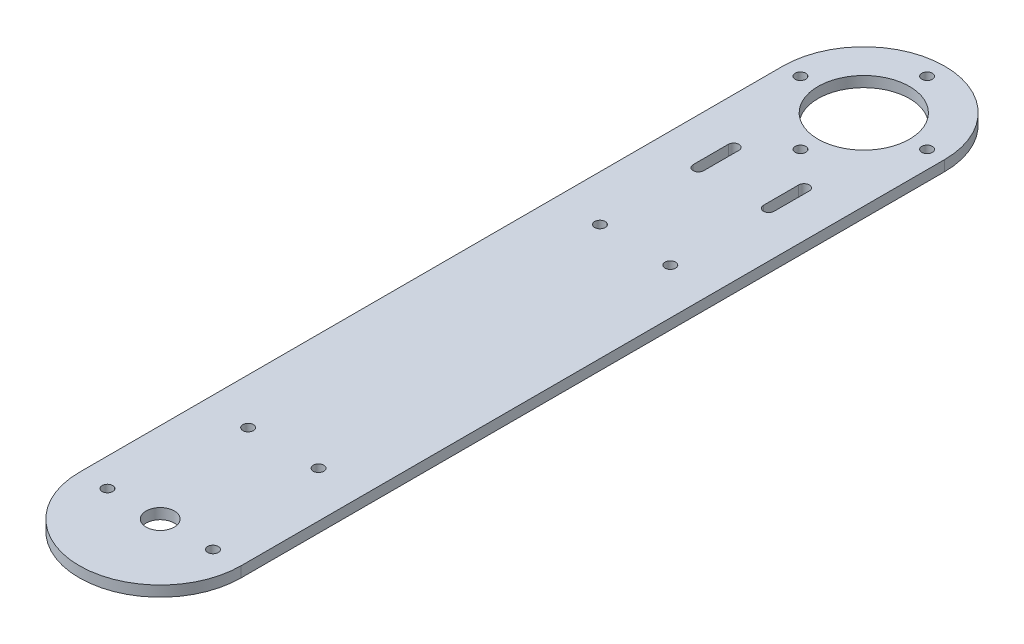
ISO-10303-21;
HEADER;
FILE_DESCRIPTION(('STEP AP214'),'2;1');
FILE_NAME('part.step','',(''),(''),'','','');
FILE_SCHEMA(('AUTOMOTIVE_DESIGN { 1 0 10303 214 1 1 1 1 }'));
ENDSEC;
DATA;
#1=APPLICATION_CONTEXT('core data for automotive mechanical design processes');
#2=APPLICATION_PROTOCOL_DEFINITION('international standard','automotive_design',2000,#1);
#3=PRODUCT_CONTEXT('',#1,'mechanical');
#4=PRODUCT('Part','Part','',(#3));
#5=PRODUCT_RELATED_PRODUCT_CATEGORY('part','',(#4));
#6=PRODUCT_DEFINITION_FORMATION('','',#4);
#7=PRODUCT_DEFINITION_CONTEXT('part definition',#1,'design');
#8=PRODUCT_DEFINITION('design','',#6,#7);
#9=PRODUCT_DEFINITION_SHAPE('','',#8);
#10=(LENGTH_UNIT() NAMED_UNIT(*) SI_UNIT(.MILLI.,.METRE.));
#11=(NAMED_UNIT(*) PLANE_ANGLE_UNIT() SI_UNIT($,.RADIAN.));
#12=(NAMED_UNIT(*) SI_UNIT($,.STERADIAN.) SOLID_ANGLE_UNIT());
#13=UNCERTAINTY_MEASURE_WITH_UNIT(LENGTH_MEASURE(1.E-05),#10,'distance_accuracy_value','');
#14=(GEOMETRIC_REPRESENTATION_CONTEXT(3) GLOBAL_UNCERTAINTY_ASSIGNED_CONTEXT((#13)) GLOBAL_UNIT_ASSIGNED_CONTEXT((#10,
#11,#12)) REPRESENTATION_CONTEXT('',''));
#15=CARTESIAN_POINT('',(0.,0.,0.));
#16=DIRECTION('',(0.,0.,1.));
#17=DIRECTION('',(1.,0.,0.));
#18=AXIS2_PLACEMENT_3D('',#15,#16,#17);
#19=CARTESIAN_POINT('',(0.,-3.,-200.));
#20=DIRECTION('',(0.,1.,0.));
#21=DIRECTION('',(0.,0.,1.));
#22=AXIS2_PLACEMENT_3D('',#19,#20,#21);
#23=CYLINDRICAL_SURFACE('',#22,23.);
#24=CARTESIAN_POINT('',(0.,0.,-200.));
#25=DIRECTION('',(0.,1.,0.));
#26=DIRECTION('',(0.,0.,1.));
#27=AXIS2_PLACEMENT_3D('',#24,#25,#26);
#28=CIRCLE('',#27,23.);
#29=CARTESIAN_POINT('',(23.,0.,-200.));
#30=VERTEX_POINT('',#29);
#31=CARTESIAN_POINT('',(-23.,0.,-200.));
#32=VERTEX_POINT('',#31);
#33=EDGE_CURVE('E251',#30,#32,#28,.T.);
#34=ORIENTED_EDGE('',*,*,#33,.F.);
#35=DIRECTION('',(0.,1.,0.));
#36=VECTOR('',#35,1.);
#37=CARTESIAN_POINT('',(23.,-3.,-200.));
#38=LINE('',#37,#36);
#39=CARTESIAN_POINT('',(23.,-3.,-200.));
#40=VERTEX_POINT('',#39);
#41=EDGE_CURVE('E11',#40,#30,#38,.T.);
#42=ORIENTED_EDGE('',*,*,#41,.F.);
#43=CARTESIAN_POINT('',(0.,-3.,-200.));
#44=DIRECTION('',(0.,1.,0.));
#45=DIRECTION('',(0.,0.,1.));
#46=AXIS2_PLACEMENT_3D('',#43,#44,#45);
#47=CIRCLE('',#46,23.);
#48=CARTESIAN_POINT('',(-23.,-3.,-200.));
#49=VERTEX_POINT('',#48);
#50=EDGE_CURVE('E254',#40,#49,#47,.T.);
#51=ORIENTED_EDGE('',*,*,#50,.T.);
#52=DIRECTION('',(0.,1.,0.));
#53=VECTOR('',#52,1.);
#54=CARTESIAN_POINT('',(-23.,-3.,-200.));
#55=LINE('',#54,#53);
#56=EDGE_CURVE('E41',#49,#32,#55,.T.);
#57=ORIENTED_EDGE('',*,*,#56,.T.);
#58=EDGE_LOOP('',(#34,#42,#51,#57));
#59=FACE_BOUND('',#58,.T.);
#60=ADVANCED_FACE('F38',(#59),#23,.T.);
#61=CARTESIAN_POINT('',(23.,-3.,-200.));
#62=DIRECTION('',(1.,0.,0.));
#63=DIRECTION('',(0.,0.,-1.));
#64=AXIS2_PLACEMENT_3D('',#61,#62,#63);
#65=PLANE('',#64);
#66=DIRECTION('',(0.,0.,-1.));
#67=VECTOR('',#66,1.);
#68=CARTESIAN_POINT('',(23.,0.,-200.));
#69=LINE('',#68,#67);
#70=CARTESIAN_POINT('',(23.,0.,0.));
#71=VERTEX_POINT('',#70);
#72=EDGE_CURVE('E258',#71,#30,#69,.T.);
#73=ORIENTED_EDGE('',*,*,#72,.F.);
#74=DIRECTION('',(0.,1.,0.));
#75=VECTOR('',#74,1.);
#76=CARTESIAN_POINT('',(23.,-3.,0.));
#77=LINE('',#76,#75);
#78=CARTESIAN_POINT('',(23.,-3.,0.));
#79=VERTEX_POINT('',#78);
#80=EDGE_CURVE('E46',#79,#71,#77,.T.);
#81=ORIENTED_EDGE('',*,*,#80,.F.);
#82=DIRECTION('',(0.,0.,-1.));
#83=VECTOR('',#82,1.);
#84=CARTESIAN_POINT('',(23.,-3.,-200.));
#85=LINE('',#84,#83);
#86=EDGE_CURVE('E264',#79,#40,#85,.T.);
#87=ORIENTED_EDGE('',*,*,#86,.T.);
#88=ORIENTED_EDGE('',*,*,#41,.T.);
#89=EDGE_LOOP('',(#73,#81,#87,#88));
#90=FACE_BOUND('',#89,.T.);
#91=ADVANCED_FACE('F290',(#90),#65,.T.);
#92=CARTESIAN_POINT('',(0.,-3.,0.));
#93=DIRECTION('',(0.,1.,0.));
#94=DIRECTION('',(0.,0.,1.));
#95=AXIS2_PLACEMENT_3D('',#92,#93,#94);
#96=CYLINDRICAL_SURFACE('',#95,23.);
#97=CARTESIAN_POINT('',(0.,0.,0.));
#98=DIRECTION('',(0.,1.,0.));
#99=DIRECTION('',(0.,0.,1.));
#100=AXIS2_PLACEMENT_3D('',#97,#98,#99);
#101=CIRCLE('',#100,23.);
#102=CARTESIAN_POINT('',(-23.,0.,0.));
#103=VERTEX_POINT('',#102);
#104=EDGE_CURVE('E272',#103,#71,#101,.T.);
#105=ORIENTED_EDGE('',*,*,#104,.F.);
#106=DIRECTION('',(0.,1.,0.));
#107=VECTOR('',#106,1.);
#108=CARTESIAN_POINT('',(-23.,-3.,0.));
#109=LINE('',#108,#107);
#110=CARTESIAN_POINT('',(-23.,-3.,0.));
#111=VERTEX_POINT('',#110);
#112=EDGE_CURVE('E277',#111,#103,#109,.T.);
#113=ORIENTED_EDGE('',*,*,#112,.F.);
#114=CARTESIAN_POINT('',(0.,-3.,0.));
#115=DIRECTION('',(0.,1.,0.));
#116=DIRECTION('',(0.,0.,1.));
#117=AXIS2_PLACEMENT_3D('',#114,#115,#116);
#118=CIRCLE('',#117,23.);
#119=EDGE_CURVE('E261',#111,#79,#118,.T.);
#120=ORIENTED_EDGE('',*,*,#119,.T.);
#121=ORIENTED_EDGE('',*,*,#80,.T.);
#122=EDGE_LOOP('',(#105,#113,#120,#121));
#123=FACE_BOUND('',#122,.T.);
#124=ADVANCED_FACE('F295',(#123),#96,.T.);
#125=CARTESIAN_POINT('',(-23.,-3.,0.));
#126=DIRECTION('',(-1.,0.,0.));
#127=DIRECTION('',(0.,0.,1.));
#128=AXIS2_PLACEMENT_3D('',#125,#126,#127);
#129=PLANE('',#128);
#130=DIRECTION('',(0.,0.,1.));
#131=VECTOR('',#130,1.);
#132=CARTESIAN_POINT('',(-23.,0.,0.));
#133=LINE('',#132,#131);
#134=EDGE_CURVE('E269',#32,#103,#133,.T.);
#135=ORIENTED_EDGE('',*,*,#134,.F.);
#136=ORIENTED_EDGE('',*,*,#56,.F.);
#137=DIRECTION('',(0.,0.,1.));
#138=VECTOR('',#137,1.);
#139=CARTESIAN_POINT('',(-23.,-3.,0.));
#140=LINE('',#139,#138);
#141=EDGE_CURVE('E257',#49,#111,#140,.T.);
#142=ORIENTED_EDGE('',*,*,#141,.T.);
#143=ORIENTED_EDGE('',*,*,#112,.T.);
#144=EDGE_LOOP('',(#135,#136,#142,#143));
#145=FACE_BOUND('',#144,.T.);
#146=ADVANCED_FACE('F285',(#145),#129,.T.);
#147=CARTESIAN_POINT('',(0.,-3.,-200.));
#148=DIRECTION('',(0.,1.,0.));
#149=DIRECTION('',(0.,0.,1.));
#150=AXIS2_PLACEMENT_3D('',#147,#148,#149);
#151=PLANE('',#150);
#152=CARTESIAN_POINT('',(-17.9999999999995,-3.,-200.));
#153=DIRECTION('',(0.,1.,0.));
#154=DIRECTION('',(0.,0.,1.));
#155=AXIS2_PLACEMENT_3D('',#152,#153,#154);
#156=CIRCLE('',#155,1.49999999999999);
#157=CARTESIAN_POINT('',(-17.9999999999995,-3.,-198.5));
#158=VERTEX_POINT('',#157);
#159=EDGE_CURVE('E594',#158,#158,#156,.T.);
#160=ORIENTED_EDGE('',*,*,#159,.T.);
#161=EDGE_LOOP('',(#160));
#162=FACE_BOUND('',#161,.T.);
#163=CARTESIAN_POINT('',(5.65430358768441E-13,-3.,-182.));
#164=DIRECTION('',(0.,1.,0.));
#165=DIRECTION('',(0.,0.,1.));
#166=AXIS2_PLACEMENT_3D('',#163,#164,#165);
#167=CIRCLE('',#166,1.5);
#168=CARTESIAN_POINT('',(5.65430358768441E-13,-3.,-180.5));
#169=VERTEX_POINT('',#168);
#170=EDGE_CURVE('E602',#169,#169,#167,.T.);
#171=ORIENTED_EDGE('',*,*,#170,.T.);
#172=EDGE_LOOP('',(#171));
#173=FACE_BOUND('',#172,.T.);
#174=CARTESIAN_POINT('',(18.0000000000005,-3.,-200.));
#175=DIRECTION('',(0.,1.,0.));
#176=DIRECTION('',(0.,0.,1.));
#177=AXIS2_PLACEMENT_3D('',#174,#175,#176);
#178=CIRCLE('',#177,1.5);
#179=CARTESIAN_POINT('',(18.0000000000005,-3.,-198.5));
#180=VERTEX_POINT('',#179);
#181=EDGE_CURVE('E158',#180,#180,#178,.T.);
#182=ORIENTED_EDGE('',*,*,#181,.T.);
#183=EDGE_LOOP('',(#182));
#184=FACE_BOUND('',#183,.T.);
#185=DIRECTION('',(0.,0.,-1.));
#186=VECTOR('',#185,1.);
#187=CARTESIAN_POINT('',(-8.5,-3.,-173.));
#188=LINE('',#187,#186);
#189=CARTESIAN_POINT('',(-8.5,-3.,-163.));
#190=VERTEX_POINT('',#189);
#191=CARTESIAN_POINT('',(-8.5,-3.,-173.));
#192=VERTEX_POINT('',#191);
#193=EDGE_CURVE('E135',#190,#192,#188,.T.);
#194=ORIENTED_EDGE('',*,*,#193,.T.);
#195=CARTESIAN_POINT('',(-10.,-3.,-173.));
#196=DIRECTION('',(0.,1.,0.));
#197=DIRECTION('',(0.,0.,1.));
#198=AXIS2_PLACEMENT_3D('',#195,#196,#197);
#199=CIRCLE('',#198,1.5);
#200=CARTESIAN_POINT('',(-11.5,-3.,-173.));
#201=VERTEX_POINT('',#200);
#202=EDGE_CURVE('E129',#192,#201,#199,.T.);
#203=ORIENTED_EDGE('',*,*,#202,.T.);
#204=DIRECTION('',(0.,0.,1.));
#205=VECTOR('',#204,1.);
#206=CARTESIAN_POINT('',(-11.5,-3.,-173.));
#207=LINE('',#206,#205);
#208=CARTESIAN_POINT('',(-11.5,-3.,-163.));
#209=VERTEX_POINT('',#208);
#210=EDGE_CURVE('E138',#201,#209,#207,.T.);
#211=ORIENTED_EDGE('',*,*,#210,.T.);
#212=CARTESIAN_POINT('',(-10.,-3.,-163.));
#213=DIRECTION('',(0.,1.,0.));
#214=DIRECTION('',(0.,0.,1.));
#215=AXIS2_PLACEMENT_3D('',#212,#213,#214);
#216=CIRCLE('',#215,1.5);
#217=EDGE_CURVE('E54',#209,#190,#216,.T.);
#218=ORIENTED_EDGE('',*,*,#217,.T.);
#219=EDGE_LOOP('',(#194,#203,#211,#218));
#220=FACE_BOUND('',#219,.T.);
#221=CARTESIAN_POINT('',(3.14043702371736E-13,-3.,-218.));
#222=DIRECTION('',(0.,1.,0.));
#223=DIRECTION('',(0.,0.,1.));
#224=AXIS2_PLACEMENT_3D('',#221,#222,#223);
#225=CIRCLE('',#224,1.5);
#226=CARTESIAN_POINT('',(3.14043702371736E-13,-3.,-216.5));
#227=VERTEX_POINT('',#226);
#228=EDGE_CURVE('E168',#227,#227,#225,.T.);
#229=ORIENTED_EDGE('',*,*,#228,.T.);
#230=EDGE_LOOP('',(#229));
#231=FACE_BOUND('',#230,.T.);
#232=CARTESIAN_POINT('',(-15.,-3.,0.));
#233=DIRECTION('',(0.,1.,0.));
#234=DIRECTION('',(0.,0.,1.));
#235=AXIS2_PLACEMENT_3D('',#232,#233,#234);
#236=CIRCLE('',#235,1.5);
#237=CARTESIAN_POINT('',(-15.,-3.,1.5));
#238=VERTEX_POINT('',#237);
#239=EDGE_CURVE('E174',#238,#238,#236,.T.);
#240=ORIENTED_EDGE('',*,*,#239,.T.);
#241=EDGE_LOOP('',(#240));
#242=FACE_BOUND('',#241,.T.);
#243=CARTESIAN_POINT('',(15.,-3.,0.));
#244=DIRECTION('',(0.,1.,0.));
#245=DIRECTION('',(0.,0.,1.));
#246=AXIS2_PLACEMENT_3D('',#243,#244,#245);
#247=CIRCLE('',#246,1.5);
#248=CARTESIAN_POINT('',(15.,-3.,1.5));
#249=VERTEX_POINT('',#248);
#250=EDGE_CURVE('E180',#249,#249,#247,.T.);
#251=ORIENTED_EDGE('',*,*,#250,.T.);
#252=EDGE_LOOP('',(#251));
#253=FACE_BOUND('',#252,.T.);
#254=DIRECTION('',(0.,0.,1.));
#255=VECTOR('',#254,1.);
#256=CARTESIAN_POINT('',(8.5,-3.,-163.));
#257=LINE('',#256,#255);
#258=CARTESIAN_POINT('',(8.5,-3.,-173.));
#259=VERTEX_POINT('',#258);
#260=CARTESIAN_POINT('',(8.5,-3.,-163.));
#261=VERTEX_POINT('',#260);
#262=EDGE_CURVE('E196',#259,#261,#257,.T.);
#263=ORIENTED_EDGE('',*,*,#262,.T.);
#264=CARTESIAN_POINT('',(10.,-3.,-163.));
#265=DIRECTION('',(0.,1.,0.));
#266=DIRECTION('',(0.,0.,1.));
#267=AXIS2_PLACEMENT_3D('',#264,#265,#266);
#268=CIRCLE('',#267,1.5);
#269=CARTESIAN_POINT('',(11.5,-3.,-163.));
#270=VERTEX_POINT('',#269);
#271=EDGE_CURVE('E186',#261,#270,#268,.T.);
#272=ORIENTED_EDGE('',*,*,#271,.T.);
#273=DIRECTION('',(0.,0.,-1.));
#274=VECTOR('',#273,1.);
#275=CARTESIAN_POINT('',(11.5,-3.,-163.));
#276=LINE('',#275,#274);
#277=CARTESIAN_POINT('',(11.5,-3.,-173.));
#278=VERTEX_POINT('',#277);
#279=EDGE_CURVE('E189',#270,#278,#276,.T.);
#280=ORIENTED_EDGE('',*,*,#279,.T.);
#281=CARTESIAN_POINT('',(10.,-3.,-173.));
#282=DIRECTION('',(0.,1.,0.));
#283=DIRECTION('',(0.,0.,1.));
#284=AXIS2_PLACEMENT_3D('',#281,#282,#283);
#285=CIRCLE('',#284,1.5);
#286=EDGE_CURVE('E193',#278,#259,#285,.T.);
#287=ORIENTED_EDGE('',*,*,#286,.T.);
#288=EDGE_LOOP('',(#263,#272,#280,#287));
#289=FACE_BOUND('',#288,.T.);
#290=CARTESIAN_POINT('',(0.,-3.,-200.));
#291=DIRECTION('',(0.,1.,0.));
#292=DIRECTION('',(0.,0.,1.));
#293=AXIS2_PLACEMENT_3D('',#290,#291,#292);
#294=CIRCLE('',#293,13.);
#295=CARTESIAN_POINT('',(0.,-3.,-187.));
#296=VERTEX_POINT('',#295);
#297=EDGE_CURVE('E218',#296,#296,#294,.T.);
#298=ORIENTED_EDGE('',*,*,#297,.T.);
#299=EDGE_LOOP('',(#298));
#300=FACE_BOUND('',#299,.T.);
#301=CARTESIAN_POINT('',(9.99999999999999,-3.,-135.));
#302=DIRECTION('',(0.,1.,0.));
#303=DIRECTION('',(0.,0.,1.));
#304=AXIS2_PLACEMENT_3D('',#301,#302,#303);
#305=CIRCLE('',#304,1.5);
#306=CARTESIAN_POINT('',(9.99999999999999,-3.,-133.5));
#307=VERTEX_POINT('',#306);
#308=EDGE_CURVE('E224',#307,#307,#305,.T.);
#309=ORIENTED_EDGE('',*,*,#308,.T.);
#310=EDGE_LOOP('',(#309));
#311=FACE_BOUND('',#310,.T.);
#312=CARTESIAN_POINT('',(-10.,-3.,-135.));
#313=DIRECTION('',(0.,1.,0.));
#314=DIRECTION('',(0.,0.,1.));
#315=AXIS2_PLACEMENT_3D('',#312,#313,#314);
#316=CIRCLE('',#315,1.5);
#317=CARTESIAN_POINT('',(-10.,-3.,-133.5));
#318=VERTEX_POINT('',#317);
#319=EDGE_CURVE('E230',#318,#318,#316,.T.);
#320=ORIENTED_EDGE('',*,*,#319,.T.);
#321=EDGE_LOOP('',(#320));
#322=FACE_BOUND('',#321,.T.);
#323=CARTESIAN_POINT('',(10.,-3.,-35.));
#324=DIRECTION('',(0.,1.,0.));
#325=DIRECTION('',(0.,0.,1.));
#326=AXIS2_PLACEMENT_3D('',#323,#324,#325);
#327=CIRCLE('',#326,1.5);
#328=CARTESIAN_POINT('',(10.,-3.,-33.5));
#329=VERTEX_POINT('',#328);
#330=EDGE_CURVE('E236',#329,#329,#327,.T.);
#331=ORIENTED_EDGE('',*,*,#330,.T.);
#332=EDGE_LOOP('',(#331));
#333=FACE_BOUND('',#332,.T.);
#334=CARTESIAN_POINT('',(-10.,-3.,-35.));
#335=DIRECTION('',(0.,1.,0.));
#336=DIRECTION('',(0.,0.,1.));
#337=AXIS2_PLACEMENT_3D('',#334,#335,#336);
#338=CIRCLE('',#337,1.5);
#339=CARTESIAN_POINT('',(-10.,-3.,-33.5));
#340=VERTEX_POINT('',#339);
#341=EDGE_CURVE('E242',#340,#340,#338,.T.);
#342=ORIENTED_EDGE('',*,*,#341,.T.);
#343=EDGE_LOOP('',(#342));
#344=FACE_BOUND('',#343,.T.);
#345=CARTESIAN_POINT('',(0.,-3.,0.));
#346=DIRECTION('',(0.,1.,0.));
#347=DIRECTION('',(0.,0.,1.));
#348=AXIS2_PLACEMENT_3D('',#345,#346,#347);
#349=CIRCLE('',#348,4.);
#350=CARTESIAN_POINT('',(0.,-3.,4.));
#351=VERTEX_POINT('',#350);
#352=EDGE_CURVE('E248',#351,#351,#349,.T.);
#353=ORIENTED_EDGE('',*,*,#352,.T.);
#354=EDGE_LOOP('',(#353));
#355=FACE_BOUND('',#354,.T.);
#356=ORIENTED_EDGE('',*,*,#50,.F.);
#357=ORIENTED_EDGE('',*,*,#86,.F.);
#358=ORIENTED_EDGE('',*,*,#119,.F.);
#359=ORIENTED_EDGE('',*,*,#141,.F.);
#360=EDGE_LOOP('',(#356,#357,#358,#359));
#361=FACE_BOUND('',#360,.T.);
#362=ADVANCED_FACE('F142',(#162,#173,#184,#220,#231,#242,#253,#289,#300,#311,#322,#333,#344,
#355,#361),#151,.F.);
#363=CARTESIAN_POINT('',(0.,0.,-200.));
#364=DIRECTION('',(0.,1.,0.));
#365=DIRECTION('',(0.,0.,1.));
#366=AXIS2_PLACEMENT_3D('',#363,#364,#365);
#367=PLANE('',#366);
#368=CARTESIAN_POINT('',(-17.9999999999995,0.,-200.));
#369=DIRECTION('',(0.,1.,0.));
#370=DIRECTION('',(0.,0.,1.));
#371=AXIS2_PLACEMENT_3D('',#368,#369,#370);
#372=CIRCLE('',#371,1.49999999999999);
#373=CARTESIAN_POINT('',(-17.9999999999995,0.,-198.5));
#374=VERTEX_POINT('',#373);
#375=EDGE_CURVE('E597',#374,#374,#372,.T.);
#376=ORIENTED_EDGE('',*,*,#375,.F.);
#377=EDGE_LOOP('',(#376));
#378=FACE_BOUND('',#377,.T.);
#379=CARTESIAN_POINT('',(5.65430358768441E-13,0.,-182.));
#380=DIRECTION('',(0.,1.,0.));
#381=DIRECTION('',(0.,0.,1.));
#382=AXIS2_PLACEMENT_3D('',#379,#380,#381);
#383=CIRCLE('',#382,1.5);
#384=CARTESIAN_POINT('',(5.65430358768441E-13,0.,-180.5));
#385=VERTEX_POINT('',#384);
#386=EDGE_CURVE('E599',#385,#385,#383,.T.);
#387=ORIENTED_EDGE('',*,*,#386,.F.);
#388=EDGE_LOOP('',(#387));
#389=FACE_BOUND('',#388,.T.);
#390=CARTESIAN_POINT('',(18.0000000000005,0.,-200.));
#391=DIRECTION('',(0.,1.,0.));
#392=DIRECTION('',(0.,0.,1.));
#393=AXIS2_PLACEMENT_3D('',#390,#391,#392);
#394=CIRCLE('',#393,1.5);
#395=CARTESIAN_POINT('',(18.0000000000005,0.,-198.5));
#396=VERTEX_POINT('',#395);
#397=EDGE_CURVE('E151',#396,#396,#394,.T.);
#398=ORIENTED_EDGE('',*,*,#397,.F.);
#399=EDGE_LOOP('',(#398));
#400=FACE_BOUND('',#399,.T.);
#401=CARTESIAN_POINT('',(-10.,0.,-173.));
#402=DIRECTION('',(0.,1.,0.));
#403=DIRECTION('',(0.,0.,1.));
#404=AXIS2_PLACEMENT_3D('',#401,#402,#403);
#405=CIRCLE('',#404,1.5);
#406=CARTESIAN_POINT('',(-8.5,0.,-173.));
#407=VERTEX_POINT('',#406);
#408=CARTESIAN_POINT('',(-11.5,0.,-173.));
#409=VERTEX_POINT('',#408);
#410=EDGE_CURVE('E62',#407,#409,#405,.T.);
#411=ORIENTED_EDGE('',*,*,#410,.F.);
#412=DIRECTION('',(0.,0.,-1.));
#413=VECTOR('',#412,1.);
#414=CARTESIAN_POINT('',(-8.5,0.,-173.));
#415=LINE('',#414,#413);
#416=CARTESIAN_POINT('',(-8.5,0.,-163.));
#417=VERTEX_POINT('',#416);
#418=EDGE_CURVE('E145',#417,#407,#415,.T.);
#419=ORIENTED_EDGE('',*,*,#418,.F.);
#420=CARTESIAN_POINT('',(-10.,0.,-163.));
#421=DIRECTION('',(0.,1.,0.));
#422=DIRECTION('',(0.,0.,1.));
#423=AXIS2_PLACEMENT_3D('',#420,#421,#422);
#424=CIRCLE('',#423,1.5);
#425=CARTESIAN_POINT('',(-11.5,0.,-163.));
#426=VERTEX_POINT('',#425);
#427=EDGE_CURVE('E148',#426,#417,#424,.T.);
#428=ORIENTED_EDGE('',*,*,#427,.F.);
#429=DIRECTION('',(0.,0.,1.));
#430=VECTOR('',#429,1.);
#431=CARTESIAN_POINT('',(-11.5,0.,-173.));
#432=LINE('',#431,#430);
#433=EDGE_CURVE('E157',#409,#426,#432,.T.);
#434=ORIENTED_EDGE('',*,*,#433,.F.);
#435=EDGE_LOOP('',(#411,#419,#428,#434));
#436=FACE_BOUND('',#435,.T.);
#437=CARTESIAN_POINT('',(3.14043702371736E-13,0.,-218.));
#438=DIRECTION('',(0.,1.,0.));
#439=DIRECTION('',(0.,0.,1.));
#440=AXIS2_PLACEMENT_3D('',#437,#438,#439);
#441=CIRCLE('',#440,1.5);
#442=CARTESIAN_POINT('',(3.14043702371736E-13,0.,-216.5));
#443=VERTEX_POINT('',#442);
#444=EDGE_CURVE('E164',#443,#443,#441,.T.);
#445=ORIENTED_EDGE('',*,*,#444,.F.);
#446=EDGE_LOOP('',(#445));
#447=FACE_BOUND('',#446,.T.);
#448=CARTESIAN_POINT('',(-15.,0.,0.));
#449=DIRECTION('',(0.,1.,0.));
#450=DIRECTION('',(0.,0.,1.));
#451=AXIS2_PLACEMENT_3D('',#448,#449,#450);
#452=CIRCLE('',#451,1.5);
#453=CARTESIAN_POINT('',(-15.,0.,1.5));
#454=VERTEX_POINT('',#453);
#455=EDGE_CURVE('E171',#454,#454,#452,.T.);
#456=ORIENTED_EDGE('',*,*,#455,.F.);
#457=EDGE_LOOP('',(#456));
#458=FACE_BOUND('',#457,.T.);
#459=CARTESIAN_POINT('',(15.,0.,0.));
#460=DIRECTION('',(0.,1.,0.));
#461=DIRECTION('',(0.,0.,1.));
#462=AXIS2_PLACEMENT_3D('',#459,#460,#461);
#463=CIRCLE('',#462,1.5);
#464=CARTESIAN_POINT('',(15.,0.,1.5));
#465=VERTEX_POINT('',#464);
#466=EDGE_CURVE('E177',#465,#465,#463,.T.);
#467=ORIENTED_EDGE('',*,*,#466,.F.);
#468=EDGE_LOOP('',(#467));
#469=FACE_BOUND('',#468,.T.);
#470=CARTESIAN_POINT('',(10.,0.,-163.));
#471=DIRECTION('',(0.,1.,0.));
#472=DIRECTION('',(0.,0.,1.));
#473=AXIS2_PLACEMENT_3D('',#470,#471,#472);
#474=CIRCLE('',#473,1.5);
#475=CARTESIAN_POINT('',(8.5,0.,-163.));
#476=VERTEX_POINT('',#475);
#477=CARTESIAN_POINT('',(11.5,0.,-163.));
#478=VERTEX_POINT('',#477);
#479=EDGE_CURVE('E183',#476,#478,#474,.T.);
#480=ORIENTED_EDGE('',*,*,#479,.F.);
#481=DIRECTION('',(0.,0.,1.));
#482=VECTOR('',#481,1.);
#483=CARTESIAN_POINT('',(8.5,0.,-163.));
#484=LINE('',#483,#482);
#485=CARTESIAN_POINT('',(8.5,0.,-173.));
#486=VERTEX_POINT('',#485);
#487=EDGE_CURVE('E190',#486,#476,#484,.T.);
#488=ORIENTED_EDGE('',*,*,#487,.F.);
#489=CARTESIAN_POINT('',(10.,0.,-173.));
#490=DIRECTION('',(0.,1.,0.));
#491=DIRECTION('',(0.,0.,1.));
#492=AXIS2_PLACEMENT_3D('',#489,#490,#491);
#493=CIRCLE('',#492,1.5);
#494=CARTESIAN_POINT('',(11.5,0.,-173.));
#495=VERTEX_POINT('',#494);
#496=EDGE_CURVE('E204',#495,#486,#493,.T.);
#497=ORIENTED_EDGE('',*,*,#496,.F.);
#498=DIRECTION('',(0.,0.,-1.));
#499=VECTOR('',#498,1.);
#500=CARTESIAN_POINT('',(11.5,0.,-163.));
#501=LINE('',#500,#499);
#502=EDGE_CURVE('E201',#478,#495,#501,.T.);
#503=ORIENTED_EDGE('',*,*,#502,.F.);
#504=EDGE_LOOP('',(#480,#488,#497,#503));
#505=FACE_BOUND('',#504,.T.);
#506=CARTESIAN_POINT('',(0.,0.,-200.));
#507=DIRECTION('',(0.,1.,0.));
#508=DIRECTION('',(0.,0.,1.));
#509=AXIS2_PLACEMENT_3D('',#506,#507,#508);
#510=CIRCLE('',#509,13.);
#511=CARTESIAN_POINT('',(0.,0.,-187.));
#512=VERTEX_POINT('',#511);
#513=EDGE_CURVE('E211',#512,#512,#510,.T.);
#514=ORIENTED_EDGE('',*,*,#513,.F.);
#515=EDGE_LOOP('',(#514));
#516=FACE_BOUND('',#515,.T.);
#517=CARTESIAN_POINT('',(9.99999999999999,0.,-135.));
#518=DIRECTION('',(0.,1.,0.));
#519=DIRECTION('',(0.,0.,1.));
#520=AXIS2_PLACEMENT_3D('',#517,#518,#519);
#521=CIRCLE('',#520,1.5);
#522=CARTESIAN_POINT('',(9.99999999999999,0.,-133.5));
#523=VERTEX_POINT('',#522);
#524=EDGE_CURVE('E221',#523,#523,#521,.T.);
#525=ORIENTED_EDGE('',*,*,#524,.F.);
#526=EDGE_LOOP('',(#525));
#527=FACE_BOUND('',#526,.T.);
#528=CARTESIAN_POINT('',(-10.,0.,-135.));
#529=DIRECTION('',(0.,1.,0.));
#530=DIRECTION('',(0.,0.,1.));
#531=AXIS2_PLACEMENT_3D('',#528,#529,#530);
#532=CIRCLE('',#531,1.5);
#533=CARTESIAN_POINT('',(-10.,0.,-133.5));
#534=VERTEX_POINT('',#533);
#535=EDGE_CURVE('E227',#534,#534,#532,.T.);
#536=ORIENTED_EDGE('',*,*,#535,.F.);
#537=EDGE_LOOP('',(#536));
#538=FACE_BOUND('',#537,.T.);
#539=CARTESIAN_POINT('',(10.,0.,-35.));
#540=DIRECTION('',(0.,1.,0.));
#541=DIRECTION('',(0.,0.,1.));
#542=AXIS2_PLACEMENT_3D('',#539,#540,#541);
#543=CIRCLE('',#542,1.5);
#544=CARTESIAN_POINT('',(10.,0.,-33.5));
#545=VERTEX_POINT('',#544);
#546=EDGE_CURVE('E233',#545,#545,#543,.T.);
#547=ORIENTED_EDGE('',*,*,#546,.F.);
#548=EDGE_LOOP('',(#547));
#549=FACE_BOUND('',#548,.T.);
#550=CARTESIAN_POINT('',(-10.,0.,-35.));
#551=DIRECTION('',(0.,1.,0.));
#552=DIRECTION('',(0.,0.,1.));
#553=AXIS2_PLACEMENT_3D('',#550,#551,#552);
#554=CIRCLE('',#553,1.5);
#555=CARTESIAN_POINT('',(-10.,0.,-33.5));
#556=VERTEX_POINT('',#555);
#557=EDGE_CURVE('E239',#556,#556,#554,.T.);
#558=ORIENTED_EDGE('',*,*,#557,.F.);
#559=EDGE_LOOP('',(#558));
#560=FACE_BOUND('',#559,.T.);
#561=CARTESIAN_POINT('',(0.,0.,0.));
#562=DIRECTION('',(0.,1.,0.));
#563=DIRECTION('',(0.,0.,1.));
#564=AXIS2_PLACEMENT_3D('',#561,#562,#563);
#565=CIRCLE('',#564,4.);
#566=CARTESIAN_POINT('',(0.,0.,4.));
#567=VERTEX_POINT('',#566);
#568=EDGE_CURVE('E245',#567,#567,#565,.T.);
#569=ORIENTED_EDGE('',*,*,#568,.F.);
#570=EDGE_LOOP('',(#569));
#571=FACE_BOUND('',#570,.T.);
#572=ORIENTED_EDGE('',*,*,#33,.T.);
#573=ORIENTED_EDGE('',*,*,#134,.T.);
#574=ORIENTED_EDGE('',*,*,#104,.T.);
#575=ORIENTED_EDGE('',*,*,#72,.T.);
#576=EDGE_LOOP('',(#572,#573,#574,#575));
#577=FACE_BOUND('',#576,.T.);
#578=ADVANCED_FACE('F287',(#378,#389,#400,#436,#447,#458,#469,#505,#516,#527,#538,#549,#560,
#571,#577),#367,.T.);
#579=CARTESIAN_POINT('',(0.,-3.,0.));
#580=DIRECTION('',(0.,1.,0.));
#581=DIRECTION('',(0.,0.,1.));
#582=AXIS2_PLACEMENT_3D('',#579,#580,#581);
#583=CYLINDRICAL_SURFACE('',#582,4.);
#584=ORIENTED_EDGE('',*,*,#352,.F.);
#585=EDGE_LOOP('',(#584));
#586=FACE_BOUND('',#585,.T.);
#587=ORIENTED_EDGE('',*,*,#568,.T.);
#588=EDGE_LOOP('',(#587));
#589=FACE_BOUND('',#588,.T.);
#590=ADVANCED_FACE('F342',(#586,#589),#583,.F.);
#591=CARTESIAN_POINT('',(-10.,-3.,-35.));
#592=DIRECTION('',(0.,1.,0.));
#593=DIRECTION('',(0.,0.,1.));
#594=AXIS2_PLACEMENT_3D('',#591,#592,#593);
#595=CYLINDRICAL_SURFACE('',#594,1.5);
#596=ORIENTED_EDGE('',*,*,#341,.F.);
#597=EDGE_LOOP('',(#596));
#598=FACE_BOUND('',#597,.T.);
#599=ORIENTED_EDGE('',*,*,#557,.T.);
#600=EDGE_LOOP('',(#599));
#601=FACE_BOUND('',#600,.T.);
#602=ADVANCED_FACE('F353',(#598,#601),#595,.F.);
#603=CARTESIAN_POINT('',(10.,-3.,-35.));
#604=DIRECTION('',(0.,1.,0.));
#605=DIRECTION('',(0.,0.,1.));
#606=AXIS2_PLACEMENT_3D('',#603,#604,#605);
#607=CYLINDRICAL_SURFACE('',#606,1.5);
#608=ORIENTED_EDGE('',*,*,#330,.F.);
#609=EDGE_LOOP('',(#608));
#610=FACE_BOUND('',#609,.T.);
#611=ORIENTED_EDGE('',*,*,#546,.T.);
#612=EDGE_LOOP('',(#611));
#613=FACE_BOUND('',#612,.T.);
#614=ADVANCED_FACE('F364',(#610,#613),#607,.F.);
#615=CARTESIAN_POINT('',(-10.,-3.,-135.));
#616=DIRECTION('',(0.,1.,0.));
#617=DIRECTION('',(0.,0.,1.));
#618=AXIS2_PLACEMENT_3D('',#615,#616,#617);
#619=CYLINDRICAL_SURFACE('',#618,1.5);
#620=ORIENTED_EDGE('',*,*,#319,.F.);
#621=EDGE_LOOP('',(#620));
#622=FACE_BOUND('',#621,.T.);
#623=ORIENTED_EDGE('',*,*,#535,.T.);
#624=EDGE_LOOP('',(#623));
#625=FACE_BOUND('',#624,.T.);
#626=ADVANCED_FACE('F375',(#622,#625),#619,.F.);
#627=CARTESIAN_POINT('',(9.99999999999999,-3.,-135.));
#628=DIRECTION('',(0.,1.,0.));
#629=DIRECTION('',(0.,0.,1.));
#630=AXIS2_PLACEMENT_3D('',#627,#628,#629);
#631=CYLINDRICAL_SURFACE('',#630,1.5);
#632=ORIENTED_EDGE('',*,*,#308,.F.);
#633=EDGE_LOOP('',(#632));
#634=FACE_BOUND('',#633,.T.);
#635=ORIENTED_EDGE('',*,*,#524,.T.);
#636=EDGE_LOOP('',(#635));
#637=FACE_BOUND('',#636,.T.);
#638=ADVANCED_FACE('F386',(#634,#637),#631,.F.);
#639=CARTESIAN_POINT('',(0.,-3.,-200.));
#640=DIRECTION('',(0.,1.,0.));
#641=DIRECTION('',(0.,0.,1.));
#642=AXIS2_PLACEMENT_3D('',#639,#640,#641);
#643=CYLINDRICAL_SURFACE('',#642,13.);
#644=ORIENTED_EDGE('',*,*,#297,.F.);
#645=EDGE_LOOP('',(#644));
#646=FACE_BOUND('',#645,.T.);
#647=ORIENTED_EDGE('',*,*,#513,.T.);
#648=EDGE_LOOP('',(#647));
#649=FACE_BOUND('',#648,.T.);
#650=ADVANCED_FACE('F397',(#646,#649),#643,.F.);
#651=CARTESIAN_POINT('',(10.,-3.,-163.));
#652=DIRECTION('',(0.,1.,0.));
#653=DIRECTION('',(0.,0.,1.));
#654=AXIS2_PLACEMENT_3D('',#651,#652,#653);
#655=CYLINDRICAL_SURFACE('',#654,1.5);
#656=ORIENTED_EDGE('',*,*,#479,.T.);
#657=DIRECTION('',(0.,1.,0.));
#658=VECTOR('',#657,1.);
#659=CARTESIAN_POINT('',(11.5,-3.,-163.));
#660=LINE('',#659,#658);
#661=EDGE_CURVE('E199',#270,#478,#660,.T.);
#662=ORIENTED_EDGE('',*,*,#661,.F.);
#663=ORIENTED_EDGE('',*,*,#271,.F.);
#664=DIRECTION('',(0.,1.,0.));
#665=VECTOR('',#664,1.);
#666=CARTESIAN_POINT('',(8.5,-3.,-163.));
#667=LINE('',#666,#665);
#668=EDGE_CURVE('E209',#261,#476,#667,.T.);
#669=ORIENTED_EDGE('',*,*,#668,.T.);
#670=EDGE_LOOP('',(#656,#662,#663,#669));
#671=FACE_BOUND('',#670,.T.);
#672=ADVANCED_FACE('F408',(#671),#655,.F.);
#673=CARTESIAN_POINT('',(8.5,-3.,-163.));
#674=DIRECTION('',(-1.,0.,0.));
#675=DIRECTION('',(0.,0.,1.));
#676=AXIS2_PLACEMENT_3D('',#673,#674,#675);
#677=PLANE('',#676);
#678=ORIENTED_EDGE('',*,*,#487,.T.);
#679=ORIENTED_EDGE('',*,*,#668,.F.);
#680=ORIENTED_EDGE('',*,*,#262,.F.);
#681=DIRECTION('',(0.,1.,0.));
#682=VECTOR('',#681,1.);
#683=CARTESIAN_POINT('',(8.5,-3.,-173.));
#684=LINE('',#683,#682);
#685=EDGE_CURVE('E212',#259,#486,#684,.T.);
#686=ORIENTED_EDGE('',*,*,#685,.T.);
#687=EDGE_LOOP('',(#678,#679,#680,#686));
#688=FACE_BOUND('',#687,.T.);
#689=ADVANCED_FACE('F419',(#688),#677,.F.);
#690=CARTESIAN_POINT('',(10.,-3.,-173.));
#691=DIRECTION('',(0.,1.,0.));
#692=DIRECTION('',(0.,0.,1.));
#693=AXIS2_PLACEMENT_3D('',#690,#691,#692);
#694=CYLINDRICAL_SURFACE('',#693,1.5);
#695=ORIENTED_EDGE('',*,*,#496,.T.);
#696=ORIENTED_EDGE('',*,*,#685,.F.);
#697=ORIENTED_EDGE('',*,*,#286,.F.);
#698=DIRECTION('',(0.,1.,0.));
#699=VECTOR('',#698,1.);
#700=CARTESIAN_POINT('',(11.5,-3.,-173.));
#701=LINE('',#700,#699);
#702=EDGE_CURVE('E214',#278,#495,#701,.T.);
#703=ORIENTED_EDGE('',*,*,#702,.T.);
#704=EDGE_LOOP('',(#695,#696,#697,#703));
#705=FACE_BOUND('',#704,.T.);
#706=ADVANCED_FACE('F430',(#705),#694,.F.);
#707=CARTESIAN_POINT('',(11.5,-3.,-163.));
#708=DIRECTION('',(1.,0.,0.));
#709=DIRECTION('',(0.,0.,-1.));
#710=AXIS2_PLACEMENT_3D('',#707,#708,#709);
#711=PLANE('',#710);
#712=ORIENTED_EDGE('',*,*,#502,.T.);
#713=ORIENTED_EDGE('',*,*,#702,.F.);
#714=ORIENTED_EDGE('',*,*,#279,.F.);
#715=ORIENTED_EDGE('',*,*,#661,.T.);
#716=EDGE_LOOP('',(#712,#713,#714,#715));
#717=FACE_BOUND('',#716,.T.);
#718=ADVANCED_FACE('F441',(#717),#711,.F.);
#719=CARTESIAN_POINT('',(15.,-3.,0.));
#720=DIRECTION('',(0.,1.,0.));
#721=DIRECTION('',(0.,0.,1.));
#722=AXIS2_PLACEMENT_3D('',#719,#720,#721);
#723=CYLINDRICAL_SURFACE('',#722,1.5);
#724=ORIENTED_EDGE('',*,*,#250,.F.);
#725=EDGE_LOOP('',(#724));
#726=FACE_BOUND('',#725,.T.);
#727=ORIENTED_EDGE('',*,*,#466,.T.);
#728=EDGE_LOOP('',(#727));
#729=FACE_BOUND('',#728,.T.);
#730=ADVANCED_FACE('F452',(#726,#729),#723,.F.);
#731=CARTESIAN_POINT('',(-15.,-3.,0.));
#732=DIRECTION('',(0.,1.,0.));
#733=DIRECTION('',(0.,0.,1.));
#734=AXIS2_PLACEMENT_3D('',#731,#732,#733);
#735=CYLINDRICAL_SURFACE('',#734,1.5);
#736=ORIENTED_EDGE('',*,*,#239,.F.);
#737=EDGE_LOOP('',(#736));
#738=FACE_BOUND('',#737,.T.);
#739=ORIENTED_EDGE('',*,*,#455,.T.);
#740=EDGE_LOOP('',(#739));
#741=FACE_BOUND('',#740,.T.);
#742=ADVANCED_FACE('F463',(#738,#741),#735,.F.);
#743=CARTESIAN_POINT('',(3.14043702371736E-13,-3.,-218.));
#744=DIRECTION('',(0.,1.,0.));
#745=DIRECTION('',(0.,0.,1.));
#746=AXIS2_PLACEMENT_3D('',#743,#744,#745);
#747=CYLINDRICAL_SURFACE('',#746,1.5);
#748=ORIENTED_EDGE('',*,*,#228,.F.);
#749=EDGE_LOOP('',(#748));
#750=FACE_BOUND('',#749,.T.);
#751=ORIENTED_EDGE('',*,*,#444,.T.);
#752=EDGE_LOOP('',(#751));
#753=FACE_BOUND('',#752,.T.);
#754=ADVANCED_FACE('F474',(#750,#753),#747,.F.);
#755=CARTESIAN_POINT('',(-10.,-3.,-173.));
#756=DIRECTION('',(0.,1.,0.));
#757=DIRECTION('',(0.,0.,1.));
#758=AXIS2_PLACEMENT_3D('',#755,#756,#757);
#759=CYLINDRICAL_SURFACE('',#758,1.5);
#760=ORIENTED_EDGE('',*,*,#410,.T.);
#761=DIRECTION('',(0.,1.,0.));
#762=VECTOR('',#761,1.);
#763=CARTESIAN_POINT('',(-11.5,-3.,-173.));
#764=LINE('',#763,#762);
#765=EDGE_CURVE('E125',#201,#409,#764,.T.);
#766=ORIENTED_EDGE('',*,*,#765,.F.);
#767=ORIENTED_EDGE('',*,*,#202,.F.);
#768=DIRECTION('',(0.,1.,0.));
#769=VECTOR('',#768,1.);
#770=CARTESIAN_POINT('',(-8.5,-3.,-173.));
#771=LINE('',#770,#769);
#772=EDGE_CURVE('E162',#192,#407,#771,.T.);
#773=ORIENTED_EDGE('',*,*,#772,.T.);
#774=EDGE_LOOP('',(#760,#766,#767,#773));
#775=FACE_BOUND('',#774,.T.);
#776=ADVANCED_FACE('F127',(#775),#759,.F.);
#777=CARTESIAN_POINT('',(-8.5,-3.,-173.));
#778=DIRECTION('',(1.,0.,0.));
#779=DIRECTION('',(0.,0.,-1.));
#780=AXIS2_PLACEMENT_3D('',#777,#778,#779);
#781=PLANE('',#780);
#782=ORIENTED_EDGE('',*,*,#418,.T.);
#783=ORIENTED_EDGE('',*,*,#772,.F.);
#784=ORIENTED_EDGE('',*,*,#193,.F.);
#785=DIRECTION('',(0.,1.,0.));
#786=VECTOR('',#785,1.);
#787=CARTESIAN_POINT('',(-8.5,-3.,-163.));
#788=LINE('',#787,#786);
#789=EDGE_CURVE('E165',#190,#417,#788,.T.);
#790=ORIENTED_EDGE('',*,*,#789,.T.);
#791=EDGE_LOOP('',(#782,#783,#784,#790));
#792=FACE_BOUND('',#791,.T.);
#793=ADVANCED_FACE('F495',(#792),#781,.F.);
#794=CARTESIAN_POINT('',(-10.,-3.,-163.));
#795=DIRECTION('',(0.,1.,0.));
#796=DIRECTION('',(0.,0.,1.));
#797=AXIS2_PLACEMENT_3D('',#794,#795,#796);
#798=CYLINDRICAL_SURFACE('',#797,1.5);
#799=ORIENTED_EDGE('',*,*,#427,.T.);
#800=ORIENTED_EDGE('',*,*,#789,.F.);
#801=ORIENTED_EDGE('',*,*,#217,.F.);
#802=DIRECTION('',(0.,1.,0.));
#803=VECTOR('',#802,1.);
#804=CARTESIAN_POINT('',(-11.5,-3.,-163.));
#805=LINE('',#804,#803);
#806=EDGE_CURVE('E134',#209,#426,#805,.T.);
#807=ORIENTED_EDGE('',*,*,#806,.T.);
#808=EDGE_LOOP('',(#799,#800,#801,#807));
#809=FACE_BOUND('',#808,.T.);
#810=ADVANCED_FACE('F505',(#809),#798,.F.);
#811=CARTESIAN_POINT('',(-11.5,-3.,-173.));
#812=DIRECTION('',(-1.,0.,0.));
#813=DIRECTION('',(0.,0.,1.));
#814=AXIS2_PLACEMENT_3D('',#811,#812,#813);
#815=PLANE('',#814);
#816=ORIENTED_EDGE('',*,*,#433,.T.);
#817=ORIENTED_EDGE('',*,*,#806,.F.);
#818=ORIENTED_EDGE('',*,*,#210,.F.);
#819=ORIENTED_EDGE('',*,*,#765,.T.);
#820=EDGE_LOOP('',(#816,#817,#818,#819));
#821=FACE_BOUND('',#820,.T.);
#822=ADVANCED_FACE('F139',(#821),#815,.F.);
#823=CARTESIAN_POINT('',(18.0000000000005,-3.,-200.));
#824=DIRECTION('',(0.,1.,0.));
#825=DIRECTION('',(0.,0.,1.));
#826=AXIS2_PLACEMENT_3D('',#823,#824,#825);
#827=CYLINDRICAL_SURFACE('',#826,1.5);
#828=ORIENTED_EDGE('',*,*,#181,.F.);
#829=EDGE_LOOP('',(#828));
#830=FACE_BOUND('',#829,.T.);
#831=ORIENTED_EDGE('',*,*,#397,.T.);
#832=EDGE_LOOP('',(#831));
#833=FACE_BOUND('',#832,.T.);
#834=ADVANCED_FACE('F525',(#830,#833),#827,.F.);
#835=CARTESIAN_POINT('',(5.65430358768441E-13,-3.,-182.));
#836=DIRECTION('',(0.,1.,0.));
#837=DIRECTION('',(0.,0.,1.));
#838=AXIS2_PLACEMENT_3D('',#835,#836,#837);
#839=CYLINDRICAL_SURFACE('',#838,1.5);
#840=ORIENTED_EDGE('',*,*,#170,.F.);
#841=EDGE_LOOP('',(#840));
#842=FACE_BOUND('',#841,.T.);
#843=ORIENTED_EDGE('',*,*,#386,.T.);
#844=EDGE_LOOP('',(#843));
#845=FACE_BOUND('',#844,.T.);
#846=ADVANCED_FACE('F535',(#842,#845),#839,.F.);
#847=CARTESIAN_POINT('',(-17.9999999999995,-3.,-200.));
#848=DIRECTION('',(0.,1.,0.));
#849=DIRECTION('',(0.,0.,1.));
#850=AXIS2_PLACEMENT_3D('',#847,#848,#849);
#851=CYLINDRICAL_SURFACE('',#850,1.49999999999999);
#852=ORIENTED_EDGE('',*,*,#159,.F.);
#853=EDGE_LOOP('',(#852));
#854=FACE_BOUND('',#853,.T.);
#855=ORIENTED_EDGE('',*,*,#375,.T.);
#856=EDGE_LOOP('',(#855));
#857=FACE_BOUND('',#856,.T.);
#858=ADVANCED_FACE('F546',(#854,#857),#851,.F.);
#859=CLOSED_SHELL('',(#60,#91,#124,#146,#362,#578,#590,#602,#614,#626,#638,#650,#672,#689,#706,
#718,#730,#742,#754,#776,#793,#810,#822,#834,#846,#858));
#860=MANIFOLD_SOLID_BREP('B2',#859);
#861=ADVANCED_BREP_SHAPE_REPRESENTATION('',(#18,#860),#14);
#862=SHAPE_DEFINITION_REPRESENTATION(#9,#861);
ENDSEC;
END-ISO-10303-21;
